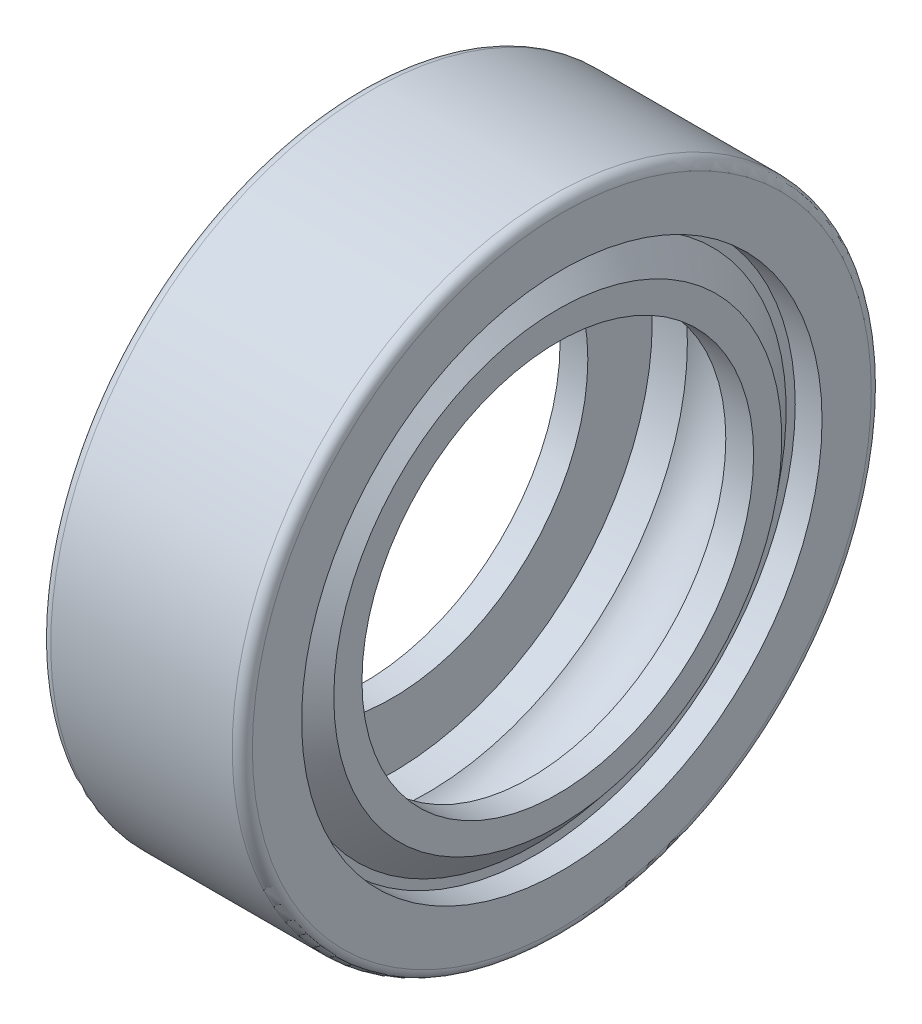
ISO-10303-21;
HEADER;
FILE_DESCRIPTION(('STEP AP214'),'2;1');
FILE_NAME('part.step','',(''),(''),'','','');
FILE_SCHEMA(('AUTOMOTIVE_DESIGN { 1 0 10303 214 1 1 1 1 }'));
ENDSEC;
DATA;
#1=APPLICATION_CONTEXT('core data for automotive mechanical design processes');
#2=APPLICATION_PROTOCOL_DEFINITION('international standard','automotive_design',2000,#1);
#3=PRODUCT_CONTEXT('',#1,'mechanical');
#4=PRODUCT('Part','Part','',(#3));
#5=PRODUCT_RELATED_PRODUCT_CATEGORY('part','',(#4));
#6=PRODUCT_DEFINITION_FORMATION('','',#4);
#7=PRODUCT_DEFINITION_CONTEXT('part definition',#1,'design');
#8=PRODUCT_DEFINITION('design','',#6,#7);
#9=PRODUCT_DEFINITION_SHAPE('','',#8);
#10=(LENGTH_UNIT() NAMED_UNIT(*) SI_UNIT(.MILLI.,.METRE.));
#11=(NAMED_UNIT(*) PLANE_ANGLE_UNIT() SI_UNIT($,.RADIAN.));
#12=(NAMED_UNIT(*) SI_UNIT($,.STERADIAN.) SOLID_ANGLE_UNIT());
#13=UNCERTAINTY_MEASURE_WITH_UNIT(LENGTH_MEASURE(1.E-05),#10,'distance_accuracy_value','');
#14=(GEOMETRIC_REPRESENTATION_CONTEXT(3) GLOBAL_UNCERTAINTY_ASSIGNED_CONTEXT((#13)) GLOBAL_UNIT_ASSIGNED_CONTEXT((#10,
#11,#12)) REPRESENTATION_CONTEXT('',''));
#15=CARTESIAN_POINT('',(0.,0.,0.));
#16=DIRECTION('',(0.,0.,1.));
#17=DIRECTION('',(1.,0.,0.));
#18=AXIS2_PLACEMENT_3D('',#15,#16,#17);
#19=CARTESIAN_POINT('',(0.,0.,0.));
#20=DIRECTION('',(1.,0.,0.));
#21=DIRECTION('',(0.,-1.,0.));
#22=AXIS2_PLACEMENT_3D('',#19,#20,#21);
#23=TOROIDAL_SURFACE('',#22,6.75005,1.408684);
#24=CARTESIAN_POINT('',(-1.00600159644334,0.,0.));
#25=DIRECTION('',(1.,0.,0.));
#26=DIRECTION('',(0.,0.,-1.));
#27=AXIS2_PLACEMENT_3D('',#24,#25,#26);
#28=CIRCLE('',#27,7.7361288);
#29=CARTESIAN_POINT('',(-1.00600159644334,0.,-7.7361288));
#30=VERTEX_POINT('',#29);
#31=EDGE_CURVE('E318',#30,#30,#28,.F.);
#32=ORIENTED_EDGE('',*,*,#31,.T.);
#33=EDGE_LOOP('',(#32));
#34=FACE_BOUND('',#33,.T.);
#35=CARTESIAN_POINT('',(1.00600159644335,0.,0.));
#36=DIRECTION('',(1.,0.,0.));
#37=DIRECTION('',(0.,0.,-1.));
#38=AXIS2_PLACEMENT_3D('',#35,#36,#37);
#39=CIRCLE('',#38,7.7361288);
#40=CARTESIAN_POINT('',(1.00600159644335,0.,-7.7361288));
#41=VERTEX_POINT('',#40);
#42=EDGE_CURVE('E321',#41,#41,#39,.T.);
#43=ORIENTED_EDGE('',*,*,#42,.T.);
#44=EDGE_LOOP('',(#43));
#45=FACE_BOUND('',#44,.T.);
#46=ADVANCED_FACE('F17',(#34,#45),#23,.F.);
#47=CARTESIAN_POINT('',(-3.29692,0.,0.));
#48=DIRECTION('',(1.,0.,0.));
#49=DIRECTION('',(0.,0.,-1.));
#50=AXIS2_PLACEMENT_3D('',#47,#48,#49);
#51=CYLINDRICAL_SURFACE('',#50,7.7361288);
#52=ORIENTED_EDGE('',*,*,#42,.F.);
#53=EDGE_LOOP('',(#52));
#54=FACE_BOUND('',#53,.T.);
#55=CARTESIAN_POINT('',(2.05092008220571,0.,0.));
#56=DIRECTION('',(1.,0.,0.));
#57=DIRECTION('',(0.,0.,-1.));
#58=AXIS2_PLACEMENT_3D('',#55,#56,#57);
#59=CIRCLE('',#58,7.7361288);
#60=CARTESIAN_POINT('',(2.05092008220571,0.,-7.7361288));
#61=VERTEX_POINT('',#60);
#62=EDGE_CURVE('E323',#61,#61,#59,.T.);
#63=ORIENTED_EDGE('',*,*,#62,.T.);
#64=EDGE_LOOP('',(#63));
#65=FACE_BOUND('',#64,.T.);
#66=ADVANCED_FACE('F292',(#54,#65),#51,.F.);
#67=CARTESIAN_POINT('',(-3.29692,0.,0.));
#68=DIRECTION('',(1.,0.,0.));
#69=DIRECTION('',(0.,0.,-1.));
#70=AXIS2_PLACEMENT_3D('',#67,#68,#69);
#71=CYLINDRICAL_SURFACE('',#70,7.7361288);
#72=ORIENTED_EDGE('',*,*,#31,.F.);
#73=EDGE_LOOP('',(#72));
#74=FACE_BOUND('',#73,.T.);
#75=CARTESIAN_POINT('',(-2.05092008220571,0.,0.));
#76=DIRECTION('',(1.,0.,0.));
#77=DIRECTION('',(0.,0.,-1.));
#78=AXIS2_PLACEMENT_3D('',#75,#76,#77);
#79=CIRCLE('',#78,7.7361288);
#80=CARTESIAN_POINT('',(-2.05092008220571,0.,-7.7361288));
#81=VERTEX_POINT('',#80);
#82=EDGE_CURVE('E363',#81,#81,#79,.T.);
#83=ORIENTED_EDGE('',*,*,#82,.F.);
#84=EDGE_LOOP('',(#83));
#85=FACE_BOUND('',#84,.T.);
#86=ADVANCED_FACE('F282',(#74,#85),#71,.F.);
#87=CARTESIAN_POINT('',(2.05092008220571,0.,0.));
#88=DIRECTION('',(1.,0.,0.));
#89=DIRECTION('',(0.,0.,-1.));
#90=AXIS2_PLACEMENT_3D('',#87,#88,#89);
#91=PLANE('',#90);
#92=ORIENTED_EDGE('',*,*,#62,.F.);
#93=EDGE_LOOP('',(#92));
#94=FACE_BOUND('',#93,.T.);
#95=CARTESIAN_POINT('',(2.05092008220571,0.,0.));
#96=DIRECTION('',(1.,0.,0.));
#97=DIRECTION('',(0.,0.,-1.));
#98=AXIS2_PLACEMENT_3D('',#95,#96,#97);
#99=CIRCLE('',#98,5.821610912);
#100=CARTESIAN_POINT('',(2.05092008220571,0.,-5.821610912));
#101=VERTEX_POINT('',#100);
#102=EDGE_CURVE('E360',#101,#101,#99,.T.);
#103=ORIENTED_EDGE('',*,*,#102,.T.);
#104=EDGE_LOOP('',(#103));
#105=FACE_BOUND('',#104,.T.);
#106=ADVANCED_FACE('F272',(#94,#105),#91,.F.);
#107=CARTESIAN_POINT('',(-2.05092008220571,0.,0.));
#108=DIRECTION('',(1.,0.,0.));
#109=DIRECTION('',(0.,0.,-1.));
#110=AXIS2_PLACEMENT_3D('',#107,#108,#109);
#111=PLANE('',#110);
#112=ORIENTED_EDGE('',*,*,#82,.T.);
#113=EDGE_LOOP('',(#112));
#114=FACE_BOUND('',#113,.T.);
#115=CARTESIAN_POINT('',(-2.05092008220571,0.,0.));
#116=DIRECTION('',(1.,0.,0.));
#117=DIRECTION('',(0.,0.,-1.));
#118=AXIS2_PLACEMENT_3D('',#115,#116,#117);
#119=CIRCLE('',#118,5.821610912);
#120=CARTESIAN_POINT('',(-2.05092008220571,0.,-5.821610912));
#121=VERTEX_POINT('',#120);
#122=EDGE_CURVE('E357',#121,#121,#119,.F.);
#123=ORIENTED_EDGE('',*,*,#122,.T.);
#124=EDGE_LOOP('',(#123));
#125=FACE_BOUND('',#124,.T.);
#126=ADVANCED_FACE('F262',(#114,#125),#111,.T.);
#127=CARTESIAN_POINT('',(-3.1650432,0.,0.));
#128=DIRECTION('',(1.,0.,0.));
#129=DIRECTION('',(0.,0.,-1.));
#130=AXIS2_PLACEMENT_3D('',#127,#128,#129);
#131=CYLINDRICAL_SURFACE('',#130,5.821610912);
#132=CARTESIAN_POINT('',(2.877312,0.,0.));
#133=DIRECTION('',(1.,0.,0.));
#134=DIRECTION('',(0.,0.,-1.));
#135=AXIS2_PLACEMENT_3D('',#132,#133,#134);
#136=CIRCLE('',#135,5.821610912);
#137=CARTESIAN_POINT('',(2.877312,0.,-5.821610912));
#138=VERTEX_POINT('',#137);
#139=EDGE_CURVE('E354',#138,#138,#136,.F.);
#140=ORIENTED_EDGE('',*,*,#139,.F.);
#141=EDGE_LOOP('',(#140));
#142=FACE_BOUND('',#141,.T.);
#143=ORIENTED_EDGE('',*,*,#102,.F.);
#144=EDGE_LOOP('',(#143));
#145=FACE_BOUND('',#144,.T.);
#146=ADVANCED_FACE('F252',(#142,#145),#131,.F.);
#147=CARTESIAN_POINT('',(-3.1650432,0.,0.));
#148=DIRECTION('',(1.,0.,0.));
#149=DIRECTION('',(0.,0.,-1.));
#150=AXIS2_PLACEMENT_3D('',#147,#148,#149);
#151=CYLINDRICAL_SURFACE('',#150,5.821610912);
#152=ORIENTED_EDGE('',*,*,#122,.F.);
#153=EDGE_LOOP('',(#152));
#154=FACE_BOUND('',#153,.T.);
#155=CARTESIAN_POINT('',(-2.877312,0.,0.));
#156=DIRECTION('',(1.,0.,0.));
#157=DIRECTION('',(0.,0.,-1.));
#158=AXIS2_PLACEMENT_3D('',#155,#156,#157);
#159=CIRCLE('',#158,5.821610912);
#160=CARTESIAN_POINT('',(-2.877312,0.,-5.821610912));
#161=VERTEX_POINT('',#160);
#162=EDGE_CURVE('E351',#161,#161,#159,.F.);
#163=ORIENTED_EDGE('',*,*,#162,.T.);
#164=EDGE_LOOP('',(#163));
#165=FACE_BOUND('',#164,.T.);
#166=ADVANCED_FACE('F242',(#154,#165),#151,.F.);
#167=CARTESIAN_POINT('',(2.877312,0.,0.));
#168=DIRECTION('',(1.,0.,0.));
#169=DIRECTION('',(0.,0.,-1.));
#170=AXIS2_PLACEMENT_3D('',#167,#168,#169);
#171=PLANE('',#170);
#172=CARTESIAN_POINT('',(2.87731200001877,0.,0.));
#173=DIRECTION('',(-1.,0.,0.));
#174=DIRECTION('',(0.,0.,1.));
#175=AXIS2_PLACEMENT_3D('',#172,#173,#174);
#176=CIRCLE('',#175,6.65910494848276);
#177=CARTESIAN_POINT('',(2.87731200001877,0.,6.65910494848276));
#178=VERTEX_POINT('',#177);
#179=EDGE_CURVE('E348',#178,#178,#176,.T.);
#180=ORIENTED_EDGE('',*,*,#179,.F.);
#181=EDGE_LOOP('',(#180));
#182=FACE_BOUND('',#181,.T.);
#183=ORIENTED_EDGE('',*,*,#139,.T.);
#184=EDGE_LOOP('',(#183));
#185=FACE_BOUND('',#184,.T.);
#186=ADVANCED_FACE('F231',(#182,#185),#171,.T.);
#187=CARTESIAN_POINT('',(-2.877312,0.,0.));
#188=DIRECTION('',(1.,0.,0.));
#189=DIRECTION('',(0.,0.,-1.));
#190=AXIS2_PLACEMENT_3D('',#187,#188,#189);
#191=PLANE('',#190);
#192=CARTESIAN_POINT('',(-2.87731200001877,0.,0.));
#193=DIRECTION('',(1.,0.,0.));
#194=DIRECTION('',(0.,0.,-1.));
#195=AXIS2_PLACEMENT_3D('',#192,#193,#194);
#196=CIRCLE('',#195,6.65910494848276);
#197=CARTESIAN_POINT('',(-2.87731200001877,0.,-6.65910494848276));
#198=VERTEX_POINT('',#197);
#199=EDGE_CURVE('E345',#198,#198,#196,.T.);
#200=ORIENTED_EDGE('',*,*,#199,.F.);
#201=EDGE_LOOP('',(#200));
#202=FACE_BOUND('',#201,.T.);
#203=ORIENTED_EDGE('',*,*,#162,.F.);
#204=EDGE_LOOP('',(#203));
#205=FACE_BOUND('',#204,.T.);
#206=ADVANCED_FACE('F220',(#202,#205),#191,.F.);
#207=CARTESIAN_POINT('',(2.20078008231894,0.,0.));
#208=DIRECTION('',(-1.,0.,0.));
#209=DIRECTION('',(0.,0.,1.));
#210=AXIS2_PLACEMENT_3D('',#207,#208,#209);
#211=CONICAL_SURFACE('',#210,7.46536429187472,0.87266462597795);
#212=CARTESIAN_POINT('',(2.20078008217585,0.,0.));
#213=DIRECTION('',(-1.,0.,0.));
#214=DIRECTION('',(0.,0.,1.));
#215=AXIS2_PLACEMENT_3D('',#212,#213,#214);
#216=CIRCLE('',#215,7.46536429204525);
#217=CARTESIAN_POINT('',(2.20078008217585,0.,7.46536429204525));
#218=VERTEX_POINT('',#217);
#219=EDGE_CURVE('E342',#218,#218,#216,.T.);
#220=ORIENTED_EDGE('',*,*,#219,.F.);
#221=EDGE_LOOP('',(#220));
#222=FACE_BOUND('',#221,.T.);
#223=ORIENTED_EDGE('',*,*,#179,.T.);
#224=EDGE_LOOP('',(#223));
#225=FACE_BOUND('',#224,.T.);
#226=ADVANCED_FACE('F209',(#222,#225),#211,.T.);
#227=CARTESIAN_POINT('',(-2.20078008231894,0.,0.));
#228=DIRECTION('',(1.,0.,0.));
#229=DIRECTION('',(0.,0.,-1.));
#230=AXIS2_PLACEMENT_3D('',#227,#228,#229);
#231=CONICAL_SURFACE('',#230,7.46536429187472,0.87266462597795);
#232=ORIENTED_EDGE('',*,*,#199,.T.);
#233=EDGE_LOOP('',(#232));
#234=FACE_BOUND('',#233,.T.);
#235=CARTESIAN_POINT('',(-2.20078008217585,0.,0.));
#236=DIRECTION('',(1.,0.,0.));
#237=DIRECTION('',(0.,0.,-1.));
#238=AXIS2_PLACEMENT_3D('',#235,#236,#237);
#239=CIRCLE('',#238,7.46536429204525);
#240=CARTESIAN_POINT('',(-2.20078008217585,0.,-7.46536429204525));
#241=VERTEX_POINT('',#240);
#242=EDGE_CURVE('E339',#241,#241,#239,.F.);
#243=ORIENTED_EDGE('',*,*,#242,.T.);
#244=EDGE_LOOP('',(#243));
#245=FACE_BOUND('',#244,.T.);
#246=ADVANCED_FACE('F198',(#234,#245),#231,.T.);
#247=CARTESIAN_POINT('',(2.20078008220571,0.,0.));
#248=DIRECTION('',(1.,0.,0.));
#249=DIRECTION('',(0.,0.,-1.));
#250=AXIS2_PLACEMENT_3D('',#247,#248,#249);
#251=PLANE('',#250);
#252=CARTESIAN_POINT('',(2.20078008220571,0.,0.));
#253=DIRECTION('',(1.,0.,0.));
#254=DIRECTION('',(0.,0.,-1.));
#255=AXIS2_PLACEMENT_3D('',#252,#253,#254);
#256=CIRCLE('',#255,7.7361288);
#257=CARTESIAN_POINT('',(2.20078008220571,0.,-7.7361288));
#258=VERTEX_POINT('',#257);
#259=EDGE_CURVE('E336',#258,#258,#256,.T.);
#260=ORIENTED_EDGE('',*,*,#259,.T.);
#261=EDGE_LOOP('',(#260));
#262=FACE_BOUND('',#261,.T.);
#263=ORIENTED_EDGE('',*,*,#219,.T.);
#264=EDGE_LOOP('',(#263));
#265=FACE_BOUND('',#264,.T.);
#266=ADVANCED_FACE('F186',(#262,#265),#251,.T.);
#267=CARTESIAN_POINT('',(-2.20078008220571,0.,0.));
#268=DIRECTION('',(1.,0.,0.));
#269=DIRECTION('',(0.,0.,-1.));
#270=AXIS2_PLACEMENT_3D('',#267,#268,#269);
#271=PLANE('',#270);
#272=CARTESIAN_POINT('',(-2.20078008220571,0.,0.));
#273=DIRECTION('',(1.,0.,0.));
#274=DIRECTION('',(0.,0.,-1.));
#275=AXIS2_PLACEMENT_3D('',#272,#273,#274);
#276=CIRCLE('',#275,7.7361288);
#277=CARTESIAN_POINT('',(-2.20078008220571,0.,-7.7361288));
#278=VERTEX_POINT('',#277);
#279=EDGE_CURVE('E333',#278,#278,#276,.F.);
#280=ORIENTED_EDGE('',*,*,#279,.T.);
#281=EDGE_LOOP('',(#280));
#282=FACE_BOUND('',#281,.T.);
#283=ORIENTED_EDGE('',*,*,#242,.F.);
#284=EDGE_LOOP('',(#283));
#285=FACE_BOUND('',#284,.T.);
#286=ADVANCED_FACE('F175',(#282,#285),#271,.F.);
#287=CARTESIAN_POINT('',(-3.29692,0.,0.));
#288=DIRECTION('',(1.,0.,0.));
#289=DIRECTION('',(0.,0.,-1.));
#290=AXIS2_PLACEMENT_3D('',#287,#288,#289);
#291=CYLINDRICAL_SURFACE('',#290,7.7361288);
#292=CARTESIAN_POINT('',(2.9972,0.,0.));
#293=DIRECTION('',(1.,0.,0.));
#294=DIRECTION('',(0.,0.,-1.));
#295=AXIS2_PLACEMENT_3D('',#292,#293,#294);
#296=CIRCLE('',#295,7.7361288);
#297=CARTESIAN_POINT('',(2.9972,0.,-7.7361288));
#298=VERTEX_POINT('',#297);
#299=EDGE_CURVE('E330',#298,#298,#296,.F.);
#300=ORIENTED_EDGE('',*,*,#299,.F.);
#301=EDGE_LOOP('',(#300));
#302=FACE_BOUND('',#301,.T.);
#303=ORIENTED_EDGE('',*,*,#259,.F.);
#304=EDGE_LOOP('',(#303));
#305=FACE_BOUND('',#304,.T.);
#306=ADVANCED_FACE('F166',(#302,#305),#291,.F.);
#307=CARTESIAN_POINT('',(-3.29692,0.,0.));
#308=DIRECTION('',(1.,0.,0.));
#309=DIRECTION('',(0.,0.,-1.));
#310=AXIS2_PLACEMENT_3D('',#307,#308,#309);
#311=CYLINDRICAL_SURFACE('',#310,7.7361288);
#312=CARTESIAN_POINT('',(-2.9972,0.,0.));
#313=DIRECTION('',(1.,0.,0.));
#314=DIRECTION('',(0.,0.,-1.));
#315=AXIS2_PLACEMENT_3D('',#312,#313,#314);
#316=CIRCLE('',#315,7.7361288);
#317=CARTESIAN_POINT('',(-2.9972,0.,-7.7361288));
#318=VERTEX_POINT('',#317);
#319=EDGE_CURVE('E327',#318,#318,#316,.F.);
#320=ORIENTED_EDGE('',*,*,#319,.T.);
#321=EDGE_LOOP('',(#320));
#322=FACE_BOUND('',#321,.T.);
#323=ORIENTED_EDGE('',*,*,#279,.F.);
#324=EDGE_LOOP('',(#323));
#325=FACE_BOUND('',#324,.T.);
#326=ADVANCED_FACE('F158',(#322,#325),#311,.F.);
#327=CARTESIAN_POINT('',(2.9972,0.,0.));
#328=DIRECTION('',(1.,0.,0.));
#329=DIRECTION('',(0.,0.,-1.));
#330=AXIS2_PLACEMENT_3D('',#327,#328,#329);
#331=PLANE('',#330);
#332=CARTESIAN_POINT('',(2.9972,0.,0.));
#333=DIRECTION('',(-1.,0.,0.));
#334=DIRECTION('',(0.,1.,0.));
#335=AXIS2_PLACEMENT_3D('',#332,#333,#334);
#336=CIRCLE('',#335,9.19988);
#337=CARTESIAN_POINT('',(2.9972,9.19988,0.));
#338=VERTEX_POINT('',#337);
#339=CARTESIAN_POINT('',(2.9972,-9.19988,0.));
#340=VERTEX_POINT('',#339);
#341=EDGE_CURVE('E48',#338,#340,#336,.T.);
#342=ORIENTED_EDGE('',*,*,#341,.F.);
#343=CARTESIAN_POINT('',(2.9972,0.,0.));
#344=DIRECTION('',(-1.,0.,0.));
#345=DIRECTION('',(0.,-1.,0.));
#346=AXIS2_PLACEMENT_3D('',#343,#344,#345);
#347=CIRCLE('',#346,9.19988);
#348=EDGE_CURVE('E53',#340,#338,#347,.T.);
#349=ORIENTED_EDGE('',*,*,#348,.F.);
#350=EDGE_LOOP('',(#342,#349));
#351=FACE_BOUND('',#350,.T.);
#352=ORIENTED_EDGE('',*,*,#299,.T.);
#353=EDGE_LOOP('',(#352));
#354=FACE_BOUND('',#353,.T.);
#355=ADVANCED_FACE('F51',(#351,#354),#331,.T.);
#356=CARTESIAN_POINT('',(-2.9972,0.,0.));
#357=DIRECTION('',(1.,0.,0.));
#358=DIRECTION('',(0.,0.,-1.));
#359=AXIS2_PLACEMENT_3D('',#356,#357,#358);
#360=PLANE('',#359);
#361=CARTESIAN_POINT('',(-2.9972,0.,0.));
#362=DIRECTION('',(1.,0.,0.));
#363=DIRECTION('',(0.,-1.,0.));
#364=AXIS2_PLACEMENT_3D('',#361,#362,#363);
#365=CIRCLE('',#364,9.19988);
#366=CARTESIAN_POINT('',(-2.9972,-9.19988,0.));
#367=VERTEX_POINT('',#366);
#368=CARTESIAN_POINT('',(-2.9972,9.19988,0.));
#369=VERTEX_POINT('',#368);
#370=EDGE_CURVE('E57',#367,#369,#365,.T.);
#371=ORIENTED_EDGE('',*,*,#370,.F.);
#372=CARTESIAN_POINT('',(-2.9972,0.,0.));
#373=DIRECTION('',(1.,0.,0.));
#374=DIRECTION('',(0.,1.,0.));
#375=AXIS2_PLACEMENT_3D('',#372,#373,#374);
#376=CIRCLE('',#375,9.19988);
#377=EDGE_CURVE('E35',#369,#367,#376,.T.);
#378=ORIENTED_EDGE('',*,*,#377,.F.);
#379=EDGE_LOOP('',(#371,#378));
#380=FACE_BOUND('',#379,.T.);
#381=ORIENTED_EDGE('',*,*,#319,.F.);
#382=EDGE_LOOP('',(#381));
#383=FACE_BOUND('',#382,.T.);
#384=ADVANCED_FACE('F89',(#380,#383),#360,.F.);
#385=CARTESIAN_POINT('',(2.69748,0.,0.));
#386=DIRECTION('',(1.,0.,0.));
#387=DIRECTION('',(0.,-1.,0.));
#388=AXIS2_PLACEMENT_3D('',#385,#386,#387);
#389=TOROIDAL_SURFACE('',#388,9.19988,0.29972);
#390=CARTESIAN_POINT('',(2.69748,0.,0.));
#391=DIRECTION('',(1.,0.,0.));
#392=DIRECTION('',(0.,0.,-1.));
#393=AXIS2_PLACEMENT_3D('',#390,#391,#392);
#394=CIRCLE('',#393,9.4996);
#395=CARTESIAN_POINT('',(2.69748,0.,-9.4996));
#396=VERTEX_POINT('',#395);
#397=EDGE_CURVE('E28',#396,#396,#394,.F.);
#398=ORIENTED_EDGE('',*,*,#397,.F.);
#399=EDGE_LOOP('',(#398));
#400=FACE_BOUND('',#399,.T.);
#401=ORIENTED_EDGE('',*,*,#341,.T.);
#402=ORIENTED_EDGE('',*,*,#348,.T.);
#403=EDGE_LOOP('',(#401,#402));
#404=FACE_BOUND('',#403,.T.);
#405=ADVANCED_FACE('F59',(#400,#404),#389,.T.);
#406=CARTESIAN_POINT('',(-2.69748,0.,0.));
#407=DIRECTION('',(1.,0.,0.));
#408=DIRECTION('',(0.,-1.,0.));
#409=AXIS2_PLACEMENT_3D('',#406,#407,#408);
#410=TOROIDAL_SURFACE('',#409,9.19988,0.29972);
#411=ORIENTED_EDGE('',*,*,#377,.T.);
#412=ORIENTED_EDGE('',*,*,#370,.T.);
#413=EDGE_LOOP('',(#411,#412));
#414=FACE_BOUND('',#413,.T.);
#415=CARTESIAN_POINT('',(-2.69748,0.,0.));
#416=DIRECTION('',(1.,0.,0.));
#417=DIRECTION('',(0.,0.,-1.));
#418=AXIS2_PLACEMENT_3D('',#415,#416,#417);
#419=CIRCLE('',#418,9.4996);
#420=CARTESIAN_POINT('',(-2.69748,0.,-9.4996));
#421=VERTEX_POINT('',#420);
#422=EDGE_CURVE('E11',#421,#421,#419,.T.);
#423=ORIENTED_EDGE('',*,*,#422,.F.);
#424=EDGE_LOOP('',(#423));
#425=FACE_BOUND('',#424,.T.);
#426=ADVANCED_FACE('F65',(#414,#425),#410,.T.);
#427=CARTESIAN_POINT('',(-3.29692,0.,0.));
#428=DIRECTION('',(1.,0.,0.));
#429=DIRECTION('',(0.,0.,-1.));
#430=AXIS2_PLACEMENT_3D('',#427,#428,#429);
#431=CYLINDRICAL_SURFACE('',#430,9.4996);
#432=ORIENTED_EDGE('',*,*,#422,.T.);
#433=EDGE_LOOP('',(#432));
#434=FACE_BOUND('',#433,.T.);
#435=ORIENTED_EDGE('',*,*,#397,.T.);
#436=EDGE_LOOP('',(#435));
#437=FACE_BOUND('',#436,.T.);
#438=ADVANCED_FACE('F75',(#434,#437),#431,.T.);
#439=CLOSED_SHELL('',(#46,#66,#86,#106,#126,#146,#166,#186,#206,#226,#246,#266,#286,#306,#326,
#355,#384,#405,#426,#438));
#440=MANIFOLD_SOLID_BREP('B1',#439);
#441=ADVANCED_BREP_SHAPE_REPRESENTATION('',(#18,#440),#14);
#442=SHAPE_DEFINITION_REPRESENTATION(#9,#441);
ENDSEC;
END-ISO-10303-21;
